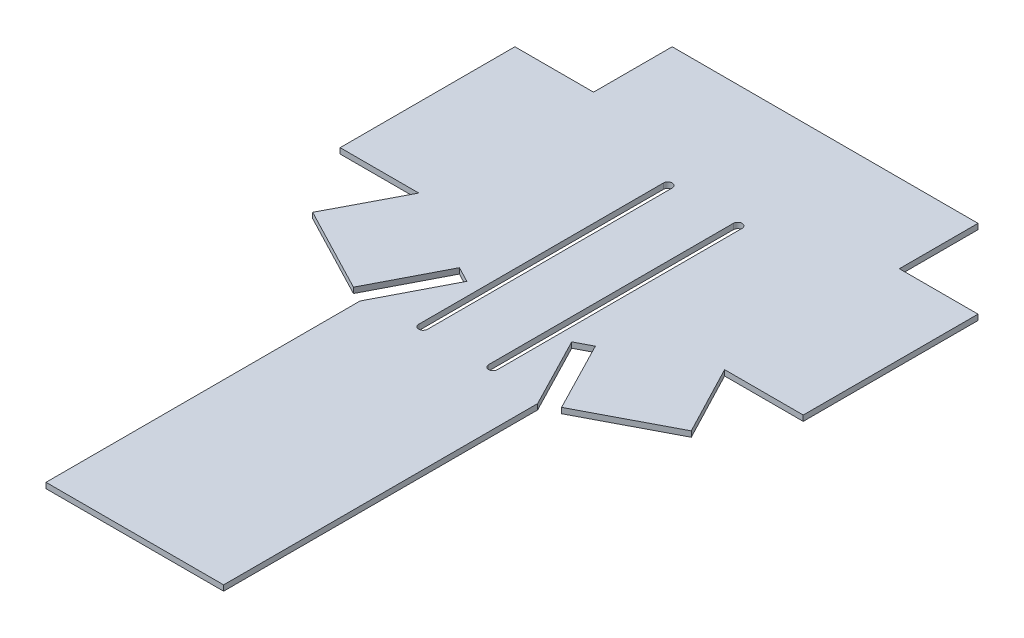
ISO-10303-21;
HEADER;
FILE_DESCRIPTION(('STEP AP214'),'2;1');
FILE_NAME('part.step','',(''),(''),'','','');
FILE_SCHEMA(('AUTOMOTIVE_DESIGN { 1 0 10303 214 1 1 1 1 }'));
ENDSEC;
DATA;
#1=APPLICATION_CONTEXT('core data for automotive mechanical design processes');
#2=APPLICATION_PROTOCOL_DEFINITION('international standard','automotive_design',2000,#1);
#3=PRODUCT_CONTEXT('',#1,'mechanical');
#4=PRODUCT('Part','Part','',(#3));
#5=PRODUCT_RELATED_PRODUCT_CATEGORY('part','',(#4));
#6=PRODUCT_DEFINITION_FORMATION('','',#4);
#7=PRODUCT_DEFINITION_CONTEXT('part definition',#1,'design');
#8=PRODUCT_DEFINITION('design','',#6,#7);
#9=PRODUCT_DEFINITION_SHAPE('','',#8);
#10=(LENGTH_UNIT() NAMED_UNIT(*) SI_UNIT(.MILLI.,.METRE.));
#11=(NAMED_UNIT(*) PLANE_ANGLE_UNIT() SI_UNIT($,.RADIAN.));
#12=(NAMED_UNIT(*) SI_UNIT($,.STERADIAN.) SOLID_ANGLE_UNIT());
#13=UNCERTAINTY_MEASURE_WITH_UNIT(LENGTH_MEASURE(1.E-05),#10,'distance_accuracy_value','');
#14=(GEOMETRIC_REPRESENTATION_CONTEXT(3) GLOBAL_UNCERTAINTY_ASSIGNED_CONTEXT((#13)) GLOBAL_UNIT_ASSIGNED_CONTEXT((#10,
#11,#12)) REPRESENTATION_CONTEXT('',''));
#15=CARTESIAN_POINT('',(0.,0.,0.));
#16=DIRECTION('',(0.,0.,1.));
#17=DIRECTION('',(1.,0.,0.));
#18=AXIS2_PLACEMENT_3D('',#15,#16,#17);
#19=CARTESIAN_POINT('',(87.5,3.175,0.));
#20=DIRECTION('',(-1.,0.,0.));
#21=DIRECTION('',(0.,0.,1.));
#22=AXIS2_PLACEMENT_3D('',#19,#20,#21);
#23=PLANE('',#22);
#24=DIRECTION('',(0.,-1.,0.));
#25=VECTOR('',#24,1.);
#26=CARTESIAN_POINT('',(87.5,3.175,0.));
#27=LINE('',#26,#25);
#28=CARTESIAN_POINT('',(87.5,3.175,0.));
#29=VERTEX_POINT('',#28);
#30=CARTESIAN_POINT('',(87.5,0.,0.));
#31=VERTEX_POINT('',#30);
#32=EDGE_CURVE('E356',#29,#31,#27,.T.);
#33=ORIENTED_EDGE('',*,*,#32,.T.);
#34=DIRECTION('',(0.,0.,-1.));
#35=VECTOR('',#34,1.);
#36=CARTESIAN_POINT('',(87.5,0.,0.));
#37=LINE('',#36,#35);
#38=CARTESIAN_POINT('',(87.5,0.,-45.));
#39=VERTEX_POINT('',#38);
#40=EDGE_CURVE('E533',#31,#39,#37,.T.);
#41=ORIENTED_EDGE('',*,*,#40,.T.);
#42=DIRECTION('',(0.,-1.,0.));
#43=VECTOR('',#42,1.);
#44=CARTESIAN_POINT('',(87.5,3.175,-45.));
#45=LINE('',#44,#43);
#46=CARTESIAN_POINT('',(87.5,3.175,-45.));
#47=VERTEX_POINT('',#46);
#48=EDGE_CURVE('E477',#47,#39,#45,.T.);
#49=ORIENTED_EDGE('',*,*,#48,.F.);
#50=DIRECTION('',(0.,0.,-1.));
#51=VECTOR('',#50,1.);
#52=CARTESIAN_POINT('',(87.5,3.175,0.));
#53=LINE('',#52,#51);
#54=EDGE_CURVE('E515',#29,#47,#53,.T.);
#55=ORIENTED_EDGE('',*,*,#54,.F.);
#56=EDGE_LOOP('',(#33,#41,#49,#55));
#57=FACE_BOUND('',#56,.T.);
#58=ADVANCED_FACE('F38',(#57),#23,.F.);
#59=CARTESIAN_POINT('',(-87.5,3.175,0.));
#60=DIRECTION('',(1.,0.,0.));
#61=DIRECTION('',(0.,0.,-1.));
#62=AXIS2_PLACEMENT_3D('',#59,#60,#61);
#63=PLANE('',#62);
#64=DIRECTION('',(0.,-1.,0.));
#65=VECTOR('',#64,1.);
#66=CARTESIAN_POINT('',(-87.5,3.175,0.));
#67=LINE('',#66,#65);
#68=CARTESIAN_POINT('',(-87.5,3.175,0.));
#69=VERTEX_POINT('',#68);
#70=CARTESIAN_POINT('',(-87.5,0.,0.));
#71=VERTEX_POINT('',#70);
#72=EDGE_CURVE('E385',#69,#71,#67,.T.);
#73=ORIENTED_EDGE('',*,*,#72,.F.);
#74=DIRECTION('',(0.,0.,1.));
#75=VECTOR('',#74,1.);
#76=CARTESIAN_POINT('',(-87.5,3.175,0.));
#77=LINE('',#76,#75);
#78=CARTESIAN_POINT('',(-87.5,3.175,-45.));
#79=VERTEX_POINT('',#78);
#80=EDGE_CURVE('E519',#79,#69,#77,.T.);
#81=ORIENTED_EDGE('',*,*,#80,.F.);
#82=DIRECTION('',(0.,-1.,0.));
#83=VECTOR('',#82,1.);
#84=CARTESIAN_POINT('',(-87.5,3.175,-45.));
#85=LINE('',#84,#83);
#86=CARTESIAN_POINT('',(-87.5,0.,-45.));
#87=VERTEX_POINT('',#86);
#88=EDGE_CURVE('E470',#79,#87,#85,.T.);
#89=ORIENTED_EDGE('',*,*,#88,.T.);
#90=DIRECTION('',(0.,0.,1.));
#91=VECTOR('',#90,1.);
#92=CARTESIAN_POINT('',(-87.5,0.,0.));
#93=LINE('',#92,#91);
#94=EDGE_CURVE('E536',#87,#71,#93,.T.);
#95=ORIENTED_EDGE('',*,*,#94,.T.);
#96=EDGE_LOOP('',(#73,#81,#89,#95));
#97=FACE_BOUND('',#96,.T.);
#98=ADVANCED_FACE('F645',(#97),#63,.F.);
#99=CARTESIAN_POINT('',(-87.5,3.175,100.));
#100=DIRECTION('',(0.46256600669502,0.,-0.886584846165455));
#101=DIRECTION('',(-0.886584846165455,0.,-0.46256600669502));
#102=AXIS2_PLACEMENT_3D('',#99,#100,#101);
#103=PLANE('',#102);
#104=DIRECTION('',(0.,1.,0.));
#105=VECTOR('',#104,1.);
#106=CARTESIAN_POINT('',(-38.8984356725843,3.175,125.357337909956));
#107=LINE('',#106,#105);
#108=CARTESIAN_POINT('',(-38.8984356725843,0.,125.357337909956));
#109=VERTEX_POINT('',#108);
#110=CARTESIAN_POINT('',(-38.8984356725843,3.175,125.357337909956));
#111=VERTEX_POINT('',#110);
#112=EDGE_CURVE('E461',#109,#111,#107,.T.);
#113=ORIENTED_EDGE('',*,*,#112,.F.);
#114=DIRECTION('',(0.886584846165455,0.,0.46256600669502));
#115=VECTOR('',#114,1.);
#116=CARTESIAN_POINT('',(-87.5,0.,100.));
#117=LINE('',#116,#115);
#118=CARTESIAN_POINT('',(-30.,0.,130.));
#119=VERTEX_POINT('',#118);
#120=EDGE_CURVE('E540',#109,#119,#117,.T.);
#121=ORIENTED_EDGE('',*,*,#120,.T.);
#122=DIRECTION('',(0.,-1.,0.));
#123=VECTOR('',#122,1.);
#124=CARTESIAN_POINT('',(-30.,3.175,130.));
#125=LINE('',#124,#123);
#126=CARTESIAN_POINT('',(-30.,3.175,130.));
#127=VERTEX_POINT('',#126);
#128=EDGE_CURVE('E529',#127,#119,#125,.T.);
#129=ORIENTED_EDGE('',*,*,#128,.F.);
#130=DIRECTION('',(0.886584846165455,0.,0.46256600669502));
#131=VECTOR('',#130,1.);
#132=CARTESIAN_POINT('',(-87.5,3.175,100.));
#133=LINE('',#132,#131);
#134=EDGE_CURVE('E523',#111,#127,#133,.T.);
#135=ORIENTED_EDGE('',*,*,#134,.F.);
#136=EDGE_LOOP('',(#113,#121,#129,#135));
#137=FACE_BOUND('',#136,.T.);
#138=ADVANCED_FACE('F616',(#137),#103,.F.);
#139=CARTESIAN_POINT('',(87.5,3.175,100.));
#140=DIRECTION('',(-0.46256600669502,0.,-0.886584846165454));
#141=DIRECTION('',(-0.886584846165455,0.,0.46256600669502));
#142=AXIS2_PLACEMENT_3D('',#139,#140,#141);
#143=PLANE('',#142);
#144=DIRECTION('',(0.,-1.,0.));
#145=VECTOR('',#144,1.);
#146=CARTESIAN_POINT('',(38.8984356725844,3.175,125.357337909956));
#147=LINE('',#146,#145);
#148=CARTESIAN_POINT('',(38.8984356725844,3.175,125.357337909956));
#149=VERTEX_POINT('',#148);
#150=CARTESIAN_POINT('',(38.8984356725844,0.,125.357337909956));
#151=VERTEX_POINT('',#150);
#152=EDGE_CURVE('E507',#149,#151,#147,.T.);
#153=ORIENTED_EDGE('',*,*,#152,.F.);
#154=DIRECTION('',(0.886584846165455,0.,-0.46256600669502));
#155=VECTOR('',#154,1.);
#156=CARTESIAN_POINT('',(87.5,3.175,100.));
#157=LINE('',#156,#155);
#158=CARTESIAN_POINT('',(30.,3.175,130.));
#159=VERTEX_POINT('',#158);
#160=EDGE_CURVE('E511',#159,#149,#157,.T.);
#161=ORIENTED_EDGE('',*,*,#160,.F.);
#162=DIRECTION('',(0.,-1.,0.));
#163=VECTOR('',#162,1.);
#164=CARTESIAN_POINT('',(30.,3.175,130.));
#165=LINE('',#164,#163);
#166=CARTESIAN_POINT('',(30.,0.,130.));
#167=VERTEX_POINT('',#166);
#168=EDGE_CURVE('E11',#159,#167,#165,.T.);
#169=ORIENTED_EDGE('',*,*,#168,.T.);
#170=DIRECTION('',(0.886584846165455,0.,-0.46256600669502));
#171=VECTOR('',#170,1.);
#172=CARTESIAN_POINT('',(87.5,0.,100.));
#173=LINE('',#172,#171);
#174=EDGE_CURVE('E510',#167,#151,#173,.T.);
#175=ORIENTED_EDGE('',*,*,#174,.T.);
#176=EDGE_LOOP('',(#153,#161,#169,#175));
#177=FACE_BOUND('',#176,.T.);
#178=ADVANCED_FACE('F40',(#177),#143,.F.);
#179=CARTESIAN_POINT('',(-30.,3.175,350.));
#180=DIRECTION('',(0.,0.,-1.));
#181=DIRECTION('',(-1.,0.,0.));
#182=AXIS2_PLACEMENT_3D('',#179,#180,#181);
#183=PLANE('',#182);
#184=DIRECTION('',(1.,0.,0.));
#185=VECTOR('',#184,1.);
#186=CARTESIAN_POINT('',(-30.,0.,350.));
#187=LINE('',#186,#185);
#188=CARTESIAN_POINT('',(-50.8193552030245,0.,350.));
#189=VERTEX_POINT('',#188);
#190=CARTESIAN_POINT('',(50.8193552030245,0.,350.));
#191=VERTEX_POINT('',#190);
#192=EDGE_CURVE('E516',#189,#191,#187,.T.);
#193=ORIENTED_EDGE('',*,*,#192,.T.);
#194=DIRECTION('',(0.,-1.,0.));
#195=VECTOR('',#194,1.);
#196=CARTESIAN_POINT('',(50.8193552030245,3.175,350.));
#197=LINE('',#196,#195);
#198=CARTESIAN_POINT('',(50.8193552030245,3.175,350.));
#199=VERTEX_POINT('',#198);
#200=EDGE_CURVE('E407',#199,#191,#197,.T.);
#201=ORIENTED_EDGE('',*,*,#200,.F.);
#202=DIRECTION('',(1.,0.,0.));
#203=VECTOR('',#202,1.);
#204=CARTESIAN_POINT('',(-30.,3.175,350.));
#205=LINE('',#204,#203);
#206=CARTESIAN_POINT('',(-50.8193552030245,3.175,350.));
#207=VERTEX_POINT('',#206);
#208=EDGE_CURVE('E526',#207,#199,#205,.T.);
#209=ORIENTED_EDGE('',*,*,#208,.F.);
#210=DIRECTION('',(0.,-1.,0.));
#211=VECTOR('',#210,1.);
#212=CARTESIAN_POINT('',(-50.8193552030245,3.175,350.));
#213=LINE('',#212,#211);
#214=EDGE_CURVE('E420',#207,#189,#213,.T.);
#215=ORIENTED_EDGE('',*,*,#214,.T.);
#216=EDGE_LOOP('',(#193,#201,#209,#215));
#217=FACE_BOUND('',#216,.T.);
#218=ADVANCED_FACE('F602',(#217),#183,.F.);
#219=CARTESIAN_POINT('',(0.,3.175,0.));
#220=DIRECTION('',(0.,1.,0.));
#221=DIRECTION('',(0.,0.,1.));
#222=AXIS2_PLACEMENT_3D('',#219,#220,#221);
#223=PLANE('',#222);
#224=CARTESIAN_POINT('',(-20.,3.175,25.));
#225=DIRECTION('',(0.,1.,0.));
#226=DIRECTION('',(0.,0.,1.));
#227=AXIS2_PLACEMENT_3D('',#224,#225,#226);
#228=CIRCLE('',#227,2.5);
#229=CARTESIAN_POINT('',(-17.5,3.175,25.));
#230=VERTEX_POINT('',#229);
#231=CARTESIAN_POINT('',(-22.5,3.175,25.));
#232=VERTEX_POINT('',#231);
#233=EDGE_CURVE('E54',#230,#232,#228,.T.);
#234=ORIENTED_EDGE('',*,*,#233,.F.);
#235=DIRECTION('',(0.,0.,-1.));
#236=VECTOR('',#235,1.);
#237=CARTESIAN_POINT('',(-17.5,3.175,25.));
#238=LINE('',#237,#236);
#239=CARTESIAN_POINT('',(-17.5,3.175,165.));
#240=VERTEX_POINT('',#239);
#241=EDGE_CURVE('E259',#240,#230,#238,.T.);
#242=ORIENTED_EDGE('',*,*,#241,.F.);
#243=CARTESIAN_POINT('',(-20.,3.175,165.));
#244=DIRECTION('',(0.,1.,0.));
#245=DIRECTION('',(0.,0.,1.));
#246=AXIS2_PLACEMENT_3D('',#243,#244,#245);
#247=CIRCLE('',#246,2.49999999999996);
#248=CARTESIAN_POINT('',(-22.5,3.175,165.));
#249=VERTEX_POINT('',#248);
#250=EDGE_CURVE('E263',#249,#240,#247,.T.);
#251=ORIENTED_EDGE('',*,*,#250,.F.);
#252=DIRECTION('',(0.,0.,1.));
#253=VECTOR('',#252,1.);
#254=CARTESIAN_POINT('',(-22.5,3.175,25.));
#255=LINE('',#254,#253);
#256=EDGE_CURVE('E272',#232,#249,#255,.T.);
#257=ORIENTED_EDGE('',*,*,#256,.F.);
#258=EDGE_LOOP('',(#234,#242,#251,#257));
#259=FACE_BOUND('',#258,.T.);
#260=CARTESIAN_POINT('',(20.,3.175,25.));
#261=DIRECTION('',(0.,1.,0.));
#262=DIRECTION('',(0.,0.,-1.));
#263=AXIS2_PLACEMENT_3D('',#260,#261,#262);
#264=CIRCLE('',#263,2.5);
#265=CARTESIAN_POINT('',(22.5,3.175,25.));
#266=VERTEX_POINT('',#265);
#267=CARTESIAN_POINT('',(17.5,3.175,25.));
#268=VERTEX_POINT('',#267);
#269=EDGE_CURVE('E62',#266,#268,#264,.T.);
#270=ORIENTED_EDGE('',*,*,#269,.F.);
#271=DIRECTION('',(0.,0.,-1.));
#272=VECTOR('',#271,1.);
#273=CARTESIAN_POINT('',(22.5,3.175,25.));
#274=LINE('',#273,#272);
#275=CARTESIAN_POINT('',(22.5,3.175,165.));
#276=VERTEX_POINT('',#275);
#277=EDGE_CURVE('E293',#276,#266,#274,.T.);
#278=ORIENTED_EDGE('',*,*,#277,.F.);
#279=CARTESIAN_POINT('',(20.,3.175,165.));
#280=DIRECTION('',(0.,1.,0.));
#281=DIRECTION('',(0.,0.,-1.));
#282=AXIS2_PLACEMENT_3D('',#279,#280,#281);
#283=CIRCLE('',#282,2.49999999999996);
#284=CARTESIAN_POINT('',(17.5,3.175,165.));
#285=VERTEX_POINT('',#284);
#286=EDGE_CURVE('E312',#285,#276,#283,.T.);
#287=ORIENTED_EDGE('',*,*,#286,.F.);
#288=DIRECTION('',(0.,0.,1.));
#289=VECTOR('',#288,1.);
#290=CARTESIAN_POINT('',(17.5,3.175,25.));
#291=LINE('',#290,#289);
#292=EDGE_CURVE('E308',#268,#285,#291,.T.);
#293=ORIENTED_EDGE('',*,*,#292,.F.);
#294=EDGE_LOOP('',(#270,#278,#287,#293));
#295=FACE_BOUND('',#294,.T.);
#296=ORIENTED_EDGE('',*,*,#80,.T.);
#297=DIRECTION('',(-1.,0.,0.));
#298=VECTOR('',#297,1.);
#299=CARTESIAN_POINT('',(-132.5,3.175,0.));
#300=LINE('',#299,#298);
#301=CARTESIAN_POINT('',(-132.5,3.175,0.));
#302=VERTEX_POINT('',#301);
#303=EDGE_CURVE('E360',#69,#302,#300,.T.);
#304=ORIENTED_EDGE('',*,*,#303,.T.);
#305=DIRECTION('',(0.,0.,1.));
#306=VECTOR('',#305,1.);
#307=CARTESIAN_POINT('',(-132.5,3.175,100.));
#308=LINE('',#307,#306);
#309=CARTESIAN_POINT('',(-132.5,3.175,100.));
#310=VERTEX_POINT('',#309);
#311=EDGE_CURVE('E363',#302,#310,#308,.T.);
#312=ORIENTED_EDGE('',*,*,#311,.T.);
#313=DIRECTION('',(1.,0.,0.));
#314=VECTOR('',#313,1.);
#315=CARTESIAN_POINT('',(-87.5,3.175,100.));
#316=LINE('',#315,#314);
#317=CARTESIAN_POINT('',(-87.5,3.175,100.));
#318=VERTEX_POINT('',#317);
#319=EDGE_CURVE('E367',#310,#318,#316,.T.);
#320=ORIENTED_EDGE('',*,*,#319,.T.);
#321=DIRECTION('',(-0.46256600669502,0.,0.886584846165455));
#322=VECTOR('',#321,1.);
#323=CARTESIAN_POINT('',(-108.315470301276,3.175,139.896318077445));
#324=LINE('',#323,#322);
#325=CARTESIAN_POINT('',(-108.315470301276,3.175,139.896318077445));
#326=VERTEX_POINT('',#325);
#327=EDGE_CURVE('E434',#318,#326,#324,.T.);
#328=ORIENTED_EDGE('',*,*,#327,.T.);
#329=DIRECTION('',(0.886584846165455,0.,0.462566006695019));
#330=VECTOR('',#329,1.);
#331=CARTESIAN_POINT('',(-108.315470301276,3.175,139.896318077445));
#332=LINE('',#331,#330);
#333=CARTESIAN_POINT('',(-59.5533037621758,3.175,165.337448445672));
#334=VERTEX_POINT('',#333);
#335=EDGE_CURVE('E437',#326,#334,#332,.T.);
#336=ORIENTED_EDGE('',*,*,#335,.T.);
#337=DIRECTION('',(0.458993349778604,0.,-0.888439702432875));
#338=VECTOR('',#337,1.);
#339=CARTESIAN_POINT('',(-59.5533037621758,3.175,165.337448445672));
#340=LINE('',#339,#338);
#341=EDGE_CURVE('E441',#334,#111,#340,.T.);
#342=ORIENTED_EDGE('',*,*,#341,.T.);
#343=ORIENTED_EDGE('',*,*,#134,.T.);
#344=DIRECTION('',(-0.458993349778604,0.,0.888439702432875));
#345=VECTOR('',#344,1.);
#346=CARTESIAN_POINT('',(-30.,3.175,130.));
#347=LINE('',#346,#345);
#348=CARTESIAN_POINT('',(-50.8193552030244,3.175,170.298496155426));
#349=VERTEX_POINT('',#348);
#350=EDGE_CURVE('E412',#127,#349,#347,.T.);
#351=ORIENTED_EDGE('',*,*,#350,.T.);
#352=DIRECTION('',(0.,0.,1.));
#353=VECTOR('',#352,1.);
#354=CARTESIAN_POINT('',(-50.8193552030244,3.175,170.298496155426));
#355=LINE('',#354,#353);
#356=EDGE_CURVE('E415',#349,#207,#355,.T.);
#357=ORIENTED_EDGE('',*,*,#356,.T.);
#358=ORIENTED_EDGE('',*,*,#208,.T.);
#359=DIRECTION('',(0.,0.,-1.));
#360=VECTOR('',#359,1.);
#361=CARTESIAN_POINT('',(50.8193552030245,3.175,170.298496155426));
#362=LINE('',#361,#360);
#363=CARTESIAN_POINT('',(50.8193552030245,3.175,170.298496155426));
#364=VERTEX_POINT('',#363);
#365=EDGE_CURVE('E394',#199,#364,#362,.T.);
#366=ORIENTED_EDGE('',*,*,#365,.T.);
#367=DIRECTION('',(-0.458993349778605,0.,-0.888439702432875));
#368=VECTOR('',#367,1.);
#369=CARTESIAN_POINT('',(30.,3.175,130.));
#370=LINE('',#369,#368);
#371=EDGE_CURVE('E390',#364,#159,#370,.T.);
#372=ORIENTED_EDGE('',*,*,#371,.T.);
#373=ORIENTED_EDGE('',*,*,#160,.T.);
#374=DIRECTION('',(0.458993349778605,0.,0.888439702432875));
#375=VECTOR('',#374,1.);
#376=CARTESIAN_POINT('',(59.5533037621758,3.175,165.337448445671));
#377=LINE('',#376,#375);
#378=CARTESIAN_POINT('',(59.5533037621758,3.175,165.337448445671));
#379=VERTEX_POINT('',#378);
#380=EDGE_CURVE('E482',#149,#379,#377,.T.);
#381=ORIENTED_EDGE('',*,*,#380,.T.);
#382=DIRECTION('',(0.886584846165455,0.,-0.462566006695018));
#383=VECTOR('',#382,1.);
#384=CARTESIAN_POINT('',(108.315470301276,3.175,139.896318077445));
#385=LINE('',#384,#383);
#386=CARTESIAN_POINT('',(108.315470301276,3.175,139.896318077445));
#387=VERTEX_POINT('',#386);
#388=EDGE_CURVE('E485',#379,#387,#385,.T.);
#389=ORIENTED_EDGE('',*,*,#388,.T.);
#390=DIRECTION('',(-0.46256600669502,0.,-0.886584846165455));
#391=VECTOR('',#390,1.);
#392=CARTESIAN_POINT('',(108.315470301276,3.175,139.896318077445));
#393=LINE('',#392,#391);
#394=CARTESIAN_POINT('',(87.5,3.175,100.));
#395=VERTEX_POINT('',#394);
#396=EDGE_CURVE('E489',#387,#395,#393,.T.);
#397=ORIENTED_EDGE('',*,*,#396,.T.);
#398=DIRECTION('',(1.,0.,0.));
#399=VECTOR('',#398,1.);
#400=CARTESIAN_POINT('',(87.5,3.175,100.));
#401=LINE('',#400,#399);
#402=CARTESIAN_POINT('',(132.5,3.175,100.));
#403=VERTEX_POINT('',#402);
#404=EDGE_CURVE('E333',#395,#403,#401,.T.);
#405=ORIENTED_EDGE('',*,*,#404,.T.);
#406=DIRECTION('',(0.,0.,-1.));
#407=VECTOR('',#406,1.);
#408=CARTESIAN_POINT('',(132.5,3.175,100.));
#409=LINE('',#408,#407);
#410=CARTESIAN_POINT('',(132.5,3.175,0.));
#411=VERTEX_POINT('',#410);
#412=EDGE_CURVE('E337',#403,#411,#409,.T.);
#413=ORIENTED_EDGE('',*,*,#412,.T.);
#414=DIRECTION('',(-1.,0.,0.));
#415=VECTOR('',#414,1.);
#416=CARTESIAN_POINT('',(132.5,3.175,0.));
#417=LINE('',#416,#415);
#418=EDGE_CURVE('E329',#411,#29,#417,.T.);
#419=ORIENTED_EDGE('',*,*,#418,.T.);
#420=ORIENTED_EDGE('',*,*,#54,.T.);
#421=DIRECTION('',(-1.,0.,0.));
#422=VECTOR('',#421,1.);
#423=CARTESIAN_POINT('',(-87.5,3.175,-45.));
#424=LINE('',#423,#422);
#425=EDGE_CURVE('E466',#47,#79,#424,.T.);
#426=ORIENTED_EDGE('',*,*,#425,.T.);
#427=EDGE_LOOP('',(#296,#304,#312,#320,#328,#336,#342,#343,#351,#357,#358,#366,#372,#373,#381,
#389,#397,#405,#413,#419,#420,#426));
#428=FACE_BOUND('',#427,.T.);
#429=ADVANCED_FACE('F576',(#259,#295,#428),#223,.T.);
#430=CARTESIAN_POINT('',(0.,0.,0.));
#431=DIRECTION('',(0.,1.,0.));
#432=DIRECTION('',(0.,0.,1.));
#433=AXIS2_PLACEMENT_3D('',#430,#431,#432);
#434=PLANE('',#433);
#435=DIRECTION('',(0.,0.,-1.));
#436=VECTOR('',#435,1.);
#437=CARTESIAN_POINT('',(-17.5,0.,25.));
#438=LINE('',#437,#436);
#439=CARTESIAN_POINT('',(-17.5,0.,165.));
#440=VERTEX_POINT('',#439);
#441=CARTESIAN_POINT('',(-17.5,0.,25.));
#442=VERTEX_POINT('',#441);
#443=EDGE_CURVE('E244',#440,#442,#438,.T.);
#444=ORIENTED_EDGE('',*,*,#443,.T.);
#445=CARTESIAN_POINT('',(-20.,0.,25.));
#446=DIRECTION('',(0.,1.,0.));
#447=DIRECTION('',(0.,0.,1.));
#448=AXIS2_PLACEMENT_3D('',#445,#446,#447);
#449=CIRCLE('',#448,2.5);
#450=CARTESIAN_POINT('',(-22.5,0.,25.));
#451=VERTEX_POINT('',#450);
#452=EDGE_CURVE('E237',#442,#451,#449,.T.);
#453=ORIENTED_EDGE('',*,*,#452,.T.);
#454=DIRECTION('',(0.,0.,1.));
#455=VECTOR('',#454,1.);
#456=CARTESIAN_POINT('',(-22.5,0.,25.));
#457=LINE('',#456,#455);
#458=CARTESIAN_POINT('',(-22.5,0.,165.));
#459=VERTEX_POINT('',#458);
#460=EDGE_CURVE('E248',#451,#459,#457,.T.);
#461=ORIENTED_EDGE('',*,*,#460,.T.);
#462=CARTESIAN_POINT('',(-20.,0.,165.));
#463=DIRECTION('',(0.,1.,0.));
#464=DIRECTION('',(0.,0.,1.));
#465=AXIS2_PLACEMENT_3D('',#462,#463,#464);
#466=CIRCLE('',#465,2.49999999999996);
#467=EDGE_CURVE('E253',#459,#440,#466,.T.);
#468=ORIENTED_EDGE('',*,*,#467,.T.);
#469=EDGE_LOOP('',(#444,#453,#461,#468));
#470=FACE_BOUND('',#469,.T.);
#471=DIRECTION('',(0.,0.,-1.));
#472=VECTOR('',#471,1.);
#473=CARTESIAN_POINT('',(22.5,0.,25.));
#474=LINE('',#473,#472);
#475=CARTESIAN_POINT('',(22.5,0.,165.));
#476=VERTEX_POINT('',#475);
#477=CARTESIAN_POINT('',(22.5,0.,25.));
#478=VERTEX_POINT('',#477);
#479=EDGE_CURVE('E301',#476,#478,#474,.T.);
#480=ORIENTED_EDGE('',*,*,#479,.T.);
#481=CARTESIAN_POINT('',(20.,0.,25.));
#482=DIRECTION('',(0.,1.,0.));
#483=DIRECTION('',(0.,0.,-1.));
#484=AXIS2_PLACEMENT_3D('',#481,#482,#483);
#485=CIRCLE('',#484,2.5);
#486=CARTESIAN_POINT('',(17.5,0.,25.));
#487=VERTEX_POINT('',#486);
#488=EDGE_CURVE('E288',#478,#487,#485,.T.);
#489=ORIENTED_EDGE('',*,*,#488,.T.);
#490=DIRECTION('',(0.,0.,1.));
#491=VECTOR('',#490,1.);
#492=CARTESIAN_POINT('',(17.5,0.,25.));
#493=LINE('',#492,#491);
#494=CARTESIAN_POINT('',(17.5,0.,165.));
#495=VERTEX_POINT('',#494);
#496=EDGE_CURVE('E292',#487,#495,#493,.T.);
#497=ORIENTED_EDGE('',*,*,#496,.T.);
#498=CARTESIAN_POINT('',(20.,0.,165.));
#499=DIRECTION('',(0.,1.,0.));
#500=DIRECTION('',(0.,0.,-1.));
#501=AXIS2_PLACEMENT_3D('',#498,#499,#500);
#502=CIRCLE('',#501,2.49999999999996);
#503=EDGE_CURVE('E297',#495,#476,#502,.T.);
#504=ORIENTED_EDGE('',*,*,#503,.T.);
#505=EDGE_LOOP('',(#480,#489,#497,#504));
#506=FACE_BOUND('',#505,.T.);
#507=ORIENTED_EDGE('',*,*,#120,.F.);
#508=DIRECTION('',(0.458993349778604,0.,-0.888439702432875));
#509=VECTOR('',#508,1.);
#510=CARTESIAN_POINT('',(-59.5533037621758,0.,165.337448445672));
#511=LINE('',#510,#509);
#512=CARTESIAN_POINT('',(-59.5533037621758,0.,165.337448445672));
#513=VERTEX_POINT('',#512);
#514=EDGE_CURVE('E438',#513,#109,#511,.T.);
#515=ORIENTED_EDGE('',*,*,#514,.F.);
#516=DIRECTION('',(0.886584846165455,0.,0.462566006695019));
#517=VECTOR('',#516,1.);
#518=CARTESIAN_POINT('',(-108.315470301276,0.,139.896318077445));
#519=LINE('',#518,#517);
#520=CARTESIAN_POINT('',(-108.315470301276,0.,139.896318077445));
#521=VERTEX_POINT('',#520);
#522=EDGE_CURVE('E448',#521,#513,#519,.T.);
#523=ORIENTED_EDGE('',*,*,#522,.F.);
#524=DIRECTION('',(-0.46256600669502,0.,0.886584846165455));
#525=VECTOR('',#524,1.);
#526=CARTESIAN_POINT('',(-108.315470301276,0.,139.896318077445));
#527=LINE('',#526,#525);
#528=CARTESIAN_POINT('',(-87.5,0.,100.));
#529=VERTEX_POINT('',#528);
#530=EDGE_CURVE('E433',#529,#521,#527,.T.);
#531=ORIENTED_EDGE('',*,*,#530,.F.);
#532=DIRECTION('',(1.,0.,0.));
#533=VECTOR('',#532,1.);
#534=CARTESIAN_POINT('',(-87.5,0.,100.));
#535=LINE('',#534,#533);
#536=CARTESIAN_POINT('',(-132.5,0.,100.));
#537=VERTEX_POINT('',#536);
#538=EDGE_CURVE('E364',#537,#529,#535,.T.);
#539=ORIENTED_EDGE('',*,*,#538,.F.);
#540=DIRECTION('',(0.,0.,1.));
#541=VECTOR('',#540,1.);
#542=CARTESIAN_POINT('',(-132.5,0.,100.));
#543=LINE('',#542,#541);
#544=CARTESIAN_POINT('',(-132.5,0.,0.));
#545=VERTEX_POINT('',#544);
#546=EDGE_CURVE('E373',#545,#537,#543,.T.);
#547=ORIENTED_EDGE('',*,*,#546,.F.);
#548=DIRECTION('',(-1.,0.,0.));
#549=VECTOR('',#548,1.);
#550=CARTESIAN_POINT('',(-132.5,0.,0.));
#551=LINE('',#550,#549);
#552=EDGE_CURVE('E359',#71,#545,#551,.T.);
#553=ORIENTED_EDGE('',*,*,#552,.F.);
#554=ORIENTED_EDGE('',*,*,#94,.F.);
#555=DIRECTION('',(-1.,0.,0.));
#556=VECTOR('',#555,1.);
#557=CARTESIAN_POINT('',(-87.5,0.,-45.));
#558=LINE('',#557,#556);
#559=EDGE_CURVE('E465',#39,#87,#558,.T.);
#560=ORIENTED_EDGE('',*,*,#559,.F.);
#561=ORIENTED_EDGE('',*,*,#40,.F.);
#562=DIRECTION('',(-1.,0.,0.));
#563=VECTOR('',#562,1.);
#564=CARTESIAN_POINT('',(132.5,0.,0.));
#565=LINE('',#564,#563);
#566=CARTESIAN_POINT('',(132.5,0.,0.));
#567=VERTEX_POINT('',#566);
#568=EDGE_CURVE('E282',#567,#31,#565,.T.);
#569=ORIENTED_EDGE('',*,*,#568,.F.);
#570=DIRECTION('',(0.,0.,-1.));
#571=VECTOR('',#570,1.);
#572=CARTESIAN_POINT('',(132.5,0.,100.));
#573=LINE('',#572,#571);
#574=CARTESIAN_POINT('',(132.5,0.,100.));
#575=VERTEX_POINT('',#574);
#576=EDGE_CURVE('E334',#575,#567,#573,.T.);
#577=ORIENTED_EDGE('',*,*,#576,.F.);
#578=DIRECTION('',(1.,0.,0.));
#579=VECTOR('',#578,1.);
#580=CARTESIAN_POINT('',(87.5,0.,100.));
#581=LINE('',#580,#579);
#582=CARTESIAN_POINT('',(87.5,0.,100.));
#583=VERTEX_POINT('',#582);
#584=EDGE_CURVE('E344',#583,#575,#581,.T.);
#585=ORIENTED_EDGE('',*,*,#584,.F.);
#586=DIRECTION('',(-0.46256600669502,0.,-0.886584846165455));
#587=VECTOR('',#586,1.);
#588=CARTESIAN_POINT('',(108.315470301276,0.,139.896318077445));
#589=LINE('',#588,#587);
#590=CARTESIAN_POINT('',(108.315470301276,0.,139.896318077445));
#591=VERTEX_POINT('',#590);
#592=EDGE_CURVE('E486',#591,#583,#589,.T.);
#593=ORIENTED_EDGE('',*,*,#592,.F.);
#594=DIRECTION('',(0.886584846165455,0.,-0.462566006695018));
#595=VECTOR('',#594,1.);
#596=CARTESIAN_POINT('',(108.315470301276,0.,139.896318077445));
#597=LINE('',#596,#595);
#598=CARTESIAN_POINT('',(59.5533037621758,0.,165.337448445671));
#599=VERTEX_POINT('',#598);
#600=EDGE_CURVE('E495',#599,#591,#597,.T.);
#601=ORIENTED_EDGE('',*,*,#600,.F.);
#602=DIRECTION('',(0.458993349778605,0.,0.888439702432875));
#603=VECTOR('',#602,1.);
#604=CARTESIAN_POINT('',(59.5533037621758,0.,165.337448445671));
#605=LINE('',#604,#603);
#606=EDGE_CURVE('E481',#151,#599,#605,.T.);
#607=ORIENTED_EDGE('',*,*,#606,.F.);
#608=ORIENTED_EDGE('',*,*,#174,.F.);
#609=DIRECTION('',(-0.458993349778605,0.,-0.888439702432875));
#610=VECTOR('',#609,1.);
#611=CARTESIAN_POINT('',(30.,0.,130.));
#612=LINE('',#611,#610);
#613=CARTESIAN_POINT('',(50.8193552030245,0.,170.298496155426));
#614=VERTEX_POINT('',#613);
#615=EDGE_CURVE('E389',#614,#167,#612,.T.);
#616=ORIENTED_EDGE('',*,*,#615,.F.);
#617=DIRECTION('',(0.,0.,-1.));
#618=VECTOR('',#617,1.);
#619=CARTESIAN_POINT('',(50.8193552030245,0.,170.298496155426));
#620=LINE('',#619,#618);
#621=EDGE_CURVE('E395',#191,#614,#620,.T.);
#622=ORIENTED_EDGE('',*,*,#621,.F.);
#623=ORIENTED_EDGE('',*,*,#192,.F.);
#624=DIRECTION('',(0.,0.,1.));
#625=VECTOR('',#624,1.);
#626=CARTESIAN_POINT('',(-50.8193552030244,0.,170.298496155426));
#627=LINE('',#626,#625);
#628=CARTESIAN_POINT('',(-50.8193552030244,0.,170.298496155426));
#629=VERTEX_POINT('',#628);
#630=EDGE_CURVE('E416',#629,#189,#627,.T.);
#631=ORIENTED_EDGE('',*,*,#630,.F.);
#632=DIRECTION('',(-0.458993349778604,0.,0.888439702432875));
#633=VECTOR('',#632,1.);
#634=CARTESIAN_POINT('',(-30.,0.,130.));
#635=LINE('',#634,#633);
#636=EDGE_CURVE('E411',#119,#629,#635,.T.);
#637=ORIENTED_EDGE('',*,*,#636,.F.);
#638=EDGE_LOOP('',(#507,#515,#523,#531,#539,#547,#553,#554,#560,#561,#569,#577,#585,#593,#601,
#607,#608,#616,#622,#623,#631,#637));
#639=FACE_BOUND('',#638,.T.);
#640=ADVANCED_FACE('F255',(#470,#506,#639),#434,.F.);
#641=CARTESIAN_POINT('',(59.5533037621758,3.175,165.337448445671));
#642=DIRECTION('',(0.888439702432875,0.,-0.458993349778605));
#643=DIRECTION('',(-0.458993349778605,0.,-0.888439702432875));
#644=AXIS2_PLACEMENT_3D('',#641,#642,#643);
#645=PLANE('',#644);
#646=ORIENTED_EDGE('',*,*,#380,.F.);
#647=ORIENTED_EDGE('',*,*,#152,.T.);
#648=ORIENTED_EDGE('',*,*,#606,.T.);
#649=DIRECTION('',(0.,-1.,0.));
#650=VECTOR('',#649,1.);
#651=CARTESIAN_POINT('',(59.5533037621758,3.175,165.337448445671));
#652=LINE('',#651,#650);
#653=EDGE_CURVE('E503',#379,#599,#652,.T.);
#654=ORIENTED_EDGE('',*,*,#653,.F.);
#655=EDGE_LOOP('',(#646,#647,#648,#654));
#656=FACE_BOUND('',#655,.T.);
#657=ADVANCED_FACE('F664',(#656),#645,.F.);
#658=CARTESIAN_POINT('',(108.315470301276,3.175,139.896318077445));
#659=DIRECTION('',(-0.462566006695018,0.,-0.886584846165456));
#660=DIRECTION('',(-0.886584846165456,0.,0.462566006695018));
#661=AXIS2_PLACEMENT_3D('',#658,#659,#660);
#662=PLANE('',#661);
#663=ORIENTED_EDGE('',*,*,#600,.T.);
#664=DIRECTION('',(0.,-1.,0.));
#665=VECTOR('',#664,1.);
#666=CARTESIAN_POINT('',(108.315470301276,3.175,139.896318077445));
#667=LINE('',#666,#665);
#668=EDGE_CURVE('E492',#387,#591,#667,.T.);
#669=ORIENTED_EDGE('',*,*,#668,.F.);
#670=ORIENTED_EDGE('',*,*,#388,.F.);
#671=ORIENTED_EDGE('',*,*,#653,.T.);
#672=EDGE_LOOP('',(#663,#669,#670,#671));
#673=FACE_BOUND('',#672,.T.);
#674=ADVANCED_FACE('F582',(#673),#662,.F.);
#675=CARTESIAN_POINT('',(108.315470301276,3.175,139.896318077445));
#676=DIRECTION('',(-0.886584846165455,0.,0.46256600669502));
#677=DIRECTION('',(0.46256600669502,0.,0.886584846165455));
#678=AXIS2_PLACEMENT_3D('',#675,#676,#677);
#679=PLANE('',#678);
#680=ORIENTED_EDGE('',*,*,#592,.T.);
#681=DIRECTION('',(0.,-1.,0.));
#682=VECTOR('',#681,1.);
#683=CARTESIAN_POINT('',(87.5,3.175,100.));
#684=LINE('',#683,#682);
#685=EDGE_CURVE('E47',#395,#583,#684,.T.);
#686=ORIENTED_EDGE('',*,*,#685,.F.);
#687=ORIENTED_EDGE('',*,*,#396,.F.);
#688=ORIENTED_EDGE('',*,*,#668,.T.);
#689=EDGE_LOOP('',(#680,#686,#687,#688));
#690=FACE_BOUND('',#689,.T.);
#691=ADVANCED_FACE('F580',(#690),#679,.F.);
#692=CARTESIAN_POINT('',(-87.5,3.175,-45.));
#693=DIRECTION('',(0.,0.,1.));
#694=DIRECTION('',(1.,0.,0.));
#695=AXIS2_PLACEMENT_3D('',#692,#693,#694);
#696=PLANE('',#695);
#697=ORIENTED_EDGE('',*,*,#559,.T.);
#698=ORIENTED_EDGE('',*,*,#88,.F.);
#699=ORIENTED_EDGE('',*,*,#425,.F.);
#700=ORIENTED_EDGE('',*,*,#48,.T.);
#701=EDGE_LOOP('',(#697,#698,#699,#700));
#702=FACE_BOUND('',#701,.T.);
#703=ADVANCED_FACE('F649',(#702),#696,.F.);
#704=CARTESIAN_POINT('',(-59.5533037621758,3.175,165.337448445672));
#705=DIRECTION('',(-0.888439702432875,0.,-0.458993349778604));
#706=DIRECTION('',(-0.458993349778604,0.,0.888439702432875));
#707=AXIS2_PLACEMENT_3D('',#704,#705,#706);
#708=PLANE('',#707);
#709=ORIENTED_EDGE('',*,*,#514,.T.);
#710=ORIENTED_EDGE('',*,*,#112,.T.);
#711=ORIENTED_EDGE('',*,*,#341,.F.);
#712=DIRECTION('',(0.,-1.,0.));
#713=VECTOR('',#712,1.);
#714=CARTESIAN_POINT('',(-59.5533037621758,3.175,165.337448445672));
#715=LINE('',#714,#713);
#716=EDGE_CURVE('E445',#334,#513,#715,.T.);
#717=ORIENTED_EDGE('',*,*,#716,.T.);
#718=EDGE_LOOP('',(#709,#710,#711,#717));
#719=FACE_BOUND('',#718,.T.);
#720=ADVANCED_FACE('F619',(#719),#708,.F.);
#721=CARTESIAN_POINT('',(-108.315470301276,3.175,139.896318077445));
#722=DIRECTION('',(0.886584846165455,0.,0.46256600669502));
#723=DIRECTION('',(0.46256600669502,0.,-0.886584846165455));
#724=AXIS2_PLACEMENT_3D('',#721,#722,#723);
#725=PLANE('',#724);
#726=ORIENTED_EDGE('',*,*,#530,.T.);
#727=DIRECTION('',(0.,-1.,0.));
#728=VECTOR('',#727,1.);
#729=CARTESIAN_POINT('',(-108.315470301276,3.175,139.896318077445));
#730=LINE('',#729,#728);
#731=EDGE_CURVE('E457',#326,#521,#730,.T.);
#732=ORIENTED_EDGE('',*,*,#731,.F.);
#733=ORIENTED_EDGE('',*,*,#327,.F.);
#734=DIRECTION('',(0.,-1.,0.));
#735=VECTOR('',#734,1.);
#736=CARTESIAN_POINT('',(-87.5,3.175,100.));
#737=LINE('',#736,#735);
#738=EDGE_CURVE('E548',#318,#529,#737,.T.);
#739=ORIENTED_EDGE('',*,*,#738,.T.);
#740=EDGE_LOOP('',(#726,#732,#733,#739));
#741=FACE_BOUND('',#740,.T.);
#742=ADVANCED_FACE('F630',(#741),#725,.F.);
#743=CARTESIAN_POINT('',(-108.315470301276,3.175,139.896318077445));
#744=DIRECTION('',(0.462566006695019,0.,-0.886584846165455));
#745=DIRECTION('',(-0.886584846165455,0.,-0.462566006695019));
#746=AXIS2_PLACEMENT_3D('',#743,#744,#745);
#747=PLANE('',#746);
#748=ORIENTED_EDGE('',*,*,#522,.T.);
#749=ORIENTED_EDGE('',*,*,#716,.F.);
#750=ORIENTED_EDGE('',*,*,#335,.F.);
#751=ORIENTED_EDGE('',*,*,#731,.T.);
#752=EDGE_LOOP('',(#748,#749,#750,#751));
#753=FACE_BOUND('',#752,.T.);
#754=ADVANCED_FACE('F625',(#753),#747,.F.);
#755=CARTESIAN_POINT('',(-30.,3.175,130.));
#756=DIRECTION('',(0.888439702432875,0.,0.458993349778604));
#757=DIRECTION('',(0.458993349778604,0.,-0.888439702432876));
#758=AXIS2_PLACEMENT_3D('',#755,#756,#757);
#759=PLANE('',#758);
#760=ORIENTED_EDGE('',*,*,#636,.T.);
#761=DIRECTION('',(0.,-1.,0.));
#762=VECTOR('',#761,1.);
#763=CARTESIAN_POINT('',(-50.8193552030244,3.175,170.298496155426));
#764=LINE('',#763,#762);
#765=EDGE_CURVE('E429',#349,#629,#764,.T.);
#766=ORIENTED_EDGE('',*,*,#765,.F.);
#767=ORIENTED_EDGE('',*,*,#350,.F.);
#768=ORIENTED_EDGE('',*,*,#128,.T.);
#769=EDGE_LOOP('',(#760,#766,#767,#768));
#770=FACE_BOUND('',#769,.T.);
#771=ADVANCED_FACE('F614',(#770),#759,.F.);
#772=CARTESIAN_POINT('',(-50.8193552030244,3.175,170.298496155426));
#773=DIRECTION('',(1.,0.,0.));
#774=DIRECTION('',(0.,0.,-1.));
#775=AXIS2_PLACEMENT_3D('',#772,#773,#774);
#776=PLANE('',#775);
#777=ORIENTED_EDGE('',*,*,#630,.T.);
#778=ORIENTED_EDGE('',*,*,#214,.F.);
#779=ORIENTED_EDGE('',*,*,#356,.F.);
#780=ORIENTED_EDGE('',*,*,#765,.T.);
#781=EDGE_LOOP('',(#777,#778,#779,#780));
#782=FACE_BOUND('',#781,.T.);
#783=ADVANCED_FACE('F606',(#782),#776,.F.);
#784=CARTESIAN_POINT('',(30.,3.175,130.));
#785=DIRECTION('',(-0.888439702432875,0.,0.458993349778605));
#786=DIRECTION('',(0.458993349778605,0.,0.888439702432875));
#787=AXIS2_PLACEMENT_3D('',#784,#785,#786);
#788=PLANE('',#787);
#789=ORIENTED_EDGE('',*,*,#615,.T.);
#790=ORIENTED_EDGE('',*,*,#168,.F.);
#791=ORIENTED_EDGE('',*,*,#371,.F.);
#792=DIRECTION('',(0.,-1.,0.));
#793=VECTOR('',#792,1.);
#794=CARTESIAN_POINT('',(50.8193552030245,3.175,170.298496155426));
#795=LINE('',#794,#793);
#796=EDGE_CURVE('E398',#364,#614,#795,.T.);
#797=ORIENTED_EDGE('',*,*,#796,.T.);
#798=EDGE_LOOP('',(#789,#790,#791,#797));
#799=FACE_BOUND('',#798,.T.);
#800=ADVANCED_FACE('F593',(#799),#788,.F.);
#801=CARTESIAN_POINT('',(50.8193552030245,3.175,170.298496155426));
#802=DIRECTION('',(-1.,0.,0.));
#803=DIRECTION('',(0.,0.,1.));
#804=AXIS2_PLACEMENT_3D('',#801,#802,#803);
#805=PLANE('',#804);
#806=ORIENTED_EDGE('',*,*,#621,.T.);
#807=ORIENTED_EDGE('',*,*,#796,.F.);
#808=ORIENTED_EDGE('',*,*,#365,.F.);
#809=ORIENTED_EDGE('',*,*,#200,.T.);
#810=EDGE_LOOP('',(#806,#807,#808,#809));
#811=FACE_BOUND('',#810,.T.);
#812=ADVANCED_FACE('F598',(#811),#805,.F.);
#813=CARTESIAN_POINT('',(-132.5,3.175,0.));
#814=DIRECTION('',(0.,0.,1.));
#815=DIRECTION('',(1.,0.,0.));
#816=AXIS2_PLACEMENT_3D('',#813,#814,#815);
#817=PLANE('',#816);
#818=ORIENTED_EDGE('',*,*,#552,.T.);
#819=DIRECTION('',(0.,-1.,0.));
#820=VECTOR('',#819,1.);
#821=CARTESIAN_POINT('',(-132.5,3.175,0.));
#822=LINE('',#821,#820);
#823=EDGE_CURVE('E381',#302,#545,#822,.T.);
#824=ORIENTED_EDGE('',*,*,#823,.F.);
#825=ORIENTED_EDGE('',*,*,#303,.F.);
#826=ORIENTED_EDGE('',*,*,#72,.T.);
#827=EDGE_LOOP('',(#818,#824,#825,#826));
#828=FACE_BOUND('',#827,.T.);
#829=ADVANCED_FACE('F642',(#828),#817,.F.);
#830=CARTESIAN_POINT('',(-132.5,3.175,100.));
#831=DIRECTION('',(1.,0.,0.));
#832=DIRECTION('',(0.,0.,-1.));
#833=AXIS2_PLACEMENT_3D('',#830,#831,#832);
#834=PLANE('',#833);
#835=ORIENTED_EDGE('',*,*,#546,.T.);
#836=DIRECTION('',(0.,-1.,0.));
#837=VECTOR('',#836,1.);
#838=CARTESIAN_POINT('',(-132.5,3.175,100.));
#839=LINE('',#838,#837);
#840=EDGE_CURVE('E370',#310,#537,#839,.T.);
#841=ORIENTED_EDGE('',*,*,#840,.F.);
#842=ORIENTED_EDGE('',*,*,#311,.F.);
#843=ORIENTED_EDGE('',*,*,#823,.T.);
#844=EDGE_LOOP('',(#835,#841,#842,#843));
#845=FACE_BOUND('',#844,.T.);
#846=ADVANCED_FACE('F638',(#845),#834,.F.);
#847=CARTESIAN_POINT('',(-87.5,3.175,100.));
#848=DIRECTION('',(0.,0.,-1.));
#849=DIRECTION('',(-1.,0.,0.));
#850=AXIS2_PLACEMENT_3D('',#847,#848,#849);
#851=PLANE('',#850);
#852=ORIENTED_EDGE('',*,*,#538,.T.);
#853=ORIENTED_EDGE('',*,*,#738,.F.);
#854=ORIENTED_EDGE('',*,*,#319,.F.);
#855=ORIENTED_EDGE('',*,*,#840,.T.);
#856=EDGE_LOOP('',(#852,#853,#854,#855));
#857=FACE_BOUND('',#856,.T.);
#858=ADVANCED_FACE('F634',(#857),#851,.F.);
#859=CARTESIAN_POINT('',(132.5,3.175,0.));
#860=DIRECTION('',(0.,0.,1.));
#861=DIRECTION('',(1.,0.,0.));
#862=AXIS2_PLACEMENT_3D('',#859,#860,#861);
#863=PLANE('',#862);
#864=ORIENTED_EDGE('',*,*,#568,.T.);
#865=ORIENTED_EDGE('',*,*,#32,.F.);
#866=ORIENTED_EDGE('',*,*,#418,.F.);
#867=DIRECTION('',(0.,-1.,0.));
#868=VECTOR('',#867,1.);
#869=CARTESIAN_POINT('',(132.5,3.175,0.));
#870=LINE('',#869,#868);
#871=EDGE_CURVE('E340',#411,#567,#870,.T.);
#872=ORIENTED_EDGE('',*,*,#871,.T.);
#873=EDGE_LOOP('',(#864,#865,#866,#872));
#874=FACE_BOUND('',#873,.T.);
#875=ADVANCED_FACE('F573',(#874),#863,.F.);
#876=CARTESIAN_POINT('',(87.5,3.175,100.));
#877=DIRECTION('',(0.,0.,-1.));
#878=DIRECTION('',(-1.,0.,0.));
#879=AXIS2_PLACEMENT_3D('',#876,#877,#878);
#880=PLANE('',#879);
#881=ORIENTED_EDGE('',*,*,#584,.T.);
#882=DIRECTION('',(0.,-1.,0.));
#883=VECTOR('',#882,1.);
#884=CARTESIAN_POINT('',(132.5,3.175,100.));
#885=LINE('',#884,#883);
#886=EDGE_CURVE('E352',#403,#575,#885,.T.);
#887=ORIENTED_EDGE('',*,*,#886,.F.);
#888=ORIENTED_EDGE('',*,*,#404,.F.);
#889=ORIENTED_EDGE('',*,*,#685,.T.);
#890=EDGE_LOOP('',(#881,#887,#888,#889));
#891=FACE_BOUND('',#890,.T.);
#892=ADVANCED_FACE('F557',(#891),#880,.F.);
#893=CARTESIAN_POINT('',(132.5,3.175,100.));
#894=DIRECTION('',(-1.,0.,0.));
#895=DIRECTION('',(0.,0.,1.));
#896=AXIS2_PLACEMENT_3D('',#893,#894,#895);
#897=PLANE('',#896);
#898=ORIENTED_EDGE('',*,*,#576,.T.);
#899=ORIENTED_EDGE('',*,*,#871,.F.);
#900=ORIENTED_EDGE('',*,*,#412,.F.);
#901=ORIENTED_EDGE('',*,*,#886,.T.);
#902=EDGE_LOOP('',(#898,#899,#900,#901));
#903=FACE_BOUND('',#902,.T.);
#904=ADVANCED_FACE('F569',(#903),#897,.F.);
#905=CARTESIAN_POINT('',(20.,0.,25.));
#906=DIRECTION('',(0.,1.,0.));
#907=DIRECTION('',(0.,0.,1.));
#908=AXIS2_PLACEMENT_3D('',#905,#906,#907);
#909=CYLINDRICAL_SURFACE('',#908,2.5);
#910=ORIENTED_EDGE('',*,*,#269,.T.);
#911=DIRECTION('',(0.,1.,0.));
#912=VECTOR('',#911,1.);
#913=CARTESIAN_POINT('',(17.5,0.,25.));
#914=LINE('',#913,#912);
#915=EDGE_CURVE('E305',#487,#268,#914,.T.);
#916=ORIENTED_EDGE('',*,*,#915,.F.);
#917=ORIENTED_EDGE('',*,*,#488,.F.);
#918=DIRECTION('',(0.,1.,0.));
#919=VECTOR('',#918,1.);
#920=CARTESIAN_POINT('',(22.5,0.,25.));
#921=LINE('',#920,#919);
#922=EDGE_CURVE('E273',#478,#266,#921,.T.);
#923=ORIENTED_EDGE('',*,*,#922,.T.);
#924=EDGE_LOOP('',(#910,#916,#917,#923));
#925=FACE_BOUND('',#924,.T.);
#926=ADVANCED_FACE('F702',(#925),#909,.F.);
#927=CARTESIAN_POINT('',(22.5,0.,25.));
#928=DIRECTION('',(1.,0.,0.));
#929=DIRECTION('',(0.,0.,-1.));
#930=AXIS2_PLACEMENT_3D('',#927,#928,#929);
#931=PLANE('',#930);
#932=ORIENTED_EDGE('',*,*,#277,.T.);
#933=ORIENTED_EDGE('',*,*,#922,.F.);
#934=ORIENTED_EDGE('',*,*,#479,.F.);
#935=DIRECTION('',(0.,1.,0.));
#936=VECTOR('',#935,1.);
#937=CARTESIAN_POINT('',(22.5,0.,165.));
#938=LINE('',#937,#936);
#939=EDGE_CURVE('E321',#476,#276,#938,.T.);
#940=ORIENTED_EDGE('',*,*,#939,.T.);
#941=EDGE_LOOP('',(#932,#933,#934,#940));
#942=FACE_BOUND('',#941,.T.);
#943=ADVANCED_FACE('F705',(#942),#931,.F.);
#944=CARTESIAN_POINT('',(20.,0.,165.));
#945=DIRECTION('',(0.,1.,0.));
#946=DIRECTION('',(0.,0.,1.));
#947=AXIS2_PLACEMENT_3D('',#944,#945,#946);
#948=CYLINDRICAL_SURFACE('',#947,2.49999999999996);
#949=ORIENTED_EDGE('',*,*,#286,.T.);
#950=ORIENTED_EDGE('',*,*,#939,.F.);
#951=ORIENTED_EDGE('',*,*,#503,.F.);
#952=DIRECTION('',(0.,1.,0.));
#953=VECTOR('',#952,1.);
#954=CARTESIAN_POINT('',(17.5,0.,165.));
#955=LINE('',#954,#953);
#956=EDGE_CURVE('E324',#495,#285,#955,.T.);
#957=ORIENTED_EDGE('',*,*,#956,.T.);
#958=EDGE_LOOP('',(#949,#950,#951,#957));
#959=FACE_BOUND('',#958,.T.);
#960=ADVANCED_FACE('F709',(#959),#948,.F.);
#961=CARTESIAN_POINT('',(17.5,0.,25.));
#962=DIRECTION('',(-1.,0.,0.));
#963=DIRECTION('',(0.,0.,1.));
#964=AXIS2_PLACEMENT_3D('',#961,#962,#963);
#965=PLANE('',#964);
#966=ORIENTED_EDGE('',*,*,#292,.T.);
#967=ORIENTED_EDGE('',*,*,#956,.F.);
#968=ORIENTED_EDGE('',*,*,#496,.F.);
#969=ORIENTED_EDGE('',*,*,#915,.T.);
#970=EDGE_LOOP('',(#966,#967,#968,#969));
#971=FACE_BOUND('',#970,.T.);
#972=ADVANCED_FACE('F706',(#971),#965,.F.);
#973=CARTESIAN_POINT('',(-20.,0.,25.));
#974=DIRECTION('',(0.,1.,0.));
#975=DIRECTION('',(0.,0.,1.));
#976=AXIS2_PLACEMENT_3D('',#973,#974,#975);
#977=CYLINDRICAL_SURFACE('',#976,2.5);
#978=ORIENTED_EDGE('',*,*,#233,.T.);
#979=DIRECTION('',(0.,1.,0.));
#980=VECTOR('',#979,1.);
#981=CARTESIAN_POINT('',(-22.5,0.,25.));
#982=LINE('',#981,#980);
#983=EDGE_CURVE('E233',#451,#232,#982,.T.);
#984=ORIENTED_EDGE('',*,*,#983,.F.);
#985=ORIENTED_EDGE('',*,*,#452,.F.);
#986=DIRECTION('',(0.,1.,0.));
#987=VECTOR('',#986,1.);
#988=CARTESIAN_POINT('',(-17.5,0.,25.));
#989=LINE('',#988,#987);
#990=EDGE_CURVE('E279',#442,#230,#989,.T.);
#991=ORIENTED_EDGE('',*,*,#990,.T.);
#992=EDGE_LOOP('',(#978,#984,#985,#991));
#993=FACE_BOUND('',#992,.T.);
#994=ADVANCED_FACE('F235',(#993),#977,.F.);
#995=CARTESIAN_POINT('',(-17.5,0.,25.));
#996=DIRECTION('',(1.,0.,0.));
#997=DIRECTION('',(0.,0.,-1.));
#998=AXIS2_PLACEMENT_3D('',#995,#996,#997);
#999=PLANE('',#998);
#1000=ORIENTED_EDGE('',*,*,#241,.T.);
#1001=ORIENTED_EDGE('',*,*,#990,.F.);
#1002=ORIENTED_EDGE('',*,*,#443,.F.);
#1003=DIRECTION('',(0.,1.,0.));
#1004=VECTOR('',#1003,1.);
#1005=CARTESIAN_POINT('',(-17.5,0.,165.));
#1006=LINE('',#1005,#1004);
#1007=EDGE_CURVE('E283',#440,#240,#1006,.T.);
#1008=ORIENTED_EDGE('',*,*,#1007,.T.);
#1009=EDGE_LOOP('',(#1000,#1001,#1002,#1008));
#1010=FACE_BOUND('',#1009,.T.);
#1011=ADVANCED_FACE('F719',(#1010),#999,.F.);
#1012=CARTESIAN_POINT('',(-20.,0.,165.));
#1013=DIRECTION('',(0.,1.,0.));
#1014=DIRECTION('',(0.,0.,1.));
#1015=AXIS2_PLACEMENT_3D('',#1012,#1013,#1014);
#1016=CYLINDRICAL_SURFACE('',#1015,2.49999999999996);
#1017=ORIENTED_EDGE('',*,*,#250,.T.);
#1018=ORIENTED_EDGE('',*,*,#1007,.F.);
#1019=ORIENTED_EDGE('',*,*,#467,.F.);
#1020=DIRECTION('',(0.,1.,0.));
#1021=VECTOR('',#1020,1.);
#1022=CARTESIAN_POINT('',(-22.5,0.,165.));
#1023=LINE('',#1022,#1021);
#1024=EDGE_CURVE('E243',#459,#249,#1023,.T.);
#1025=ORIENTED_EDGE('',*,*,#1024,.T.);
#1026=EDGE_LOOP('',(#1017,#1018,#1019,#1025));
#1027=FACE_BOUND('',#1026,.T.);
#1028=ADVANCED_FACE('F722',(#1027),#1016,.F.);
#1029=CARTESIAN_POINT('',(-22.5,0.,25.));
#1030=DIRECTION('',(-1.,0.,0.));
#1031=DIRECTION('',(0.,0.,1.));
#1032=AXIS2_PLACEMENT_3D('',#1029,#1030,#1031);
#1033=PLANE('',#1032);
#1034=ORIENTED_EDGE('',*,*,#256,.T.);
#1035=ORIENTED_EDGE('',*,*,#1024,.F.);
#1036=ORIENTED_EDGE('',*,*,#460,.F.);
#1037=ORIENTED_EDGE('',*,*,#983,.T.);
#1038=EDGE_LOOP('',(#1034,#1035,#1036,#1037));
#1039=FACE_BOUND('',#1038,.T.);
#1040=ADVANCED_FACE('F249',(#1039),#1033,.F.);
#1041=CLOSED_SHELL('',(#58,#98,#138,#178,#218,#429,#640,#657,#674,#691,#703,#720,#742,#754,#771,
#783,#800,#812,#829,#846,#858,#875,#892,#904,#926,#943,#960,#972,#994,#1011,#1028,#1040));
#1042=MANIFOLD_SOLID_BREP('B2',#1041);
#1043=ADVANCED_BREP_SHAPE_REPRESENTATION('',(#18,#1042),#14);
#1044=SHAPE_DEFINITION_REPRESENTATION(#9,#1043);
ENDSEC;
END-ISO-10303-21;
